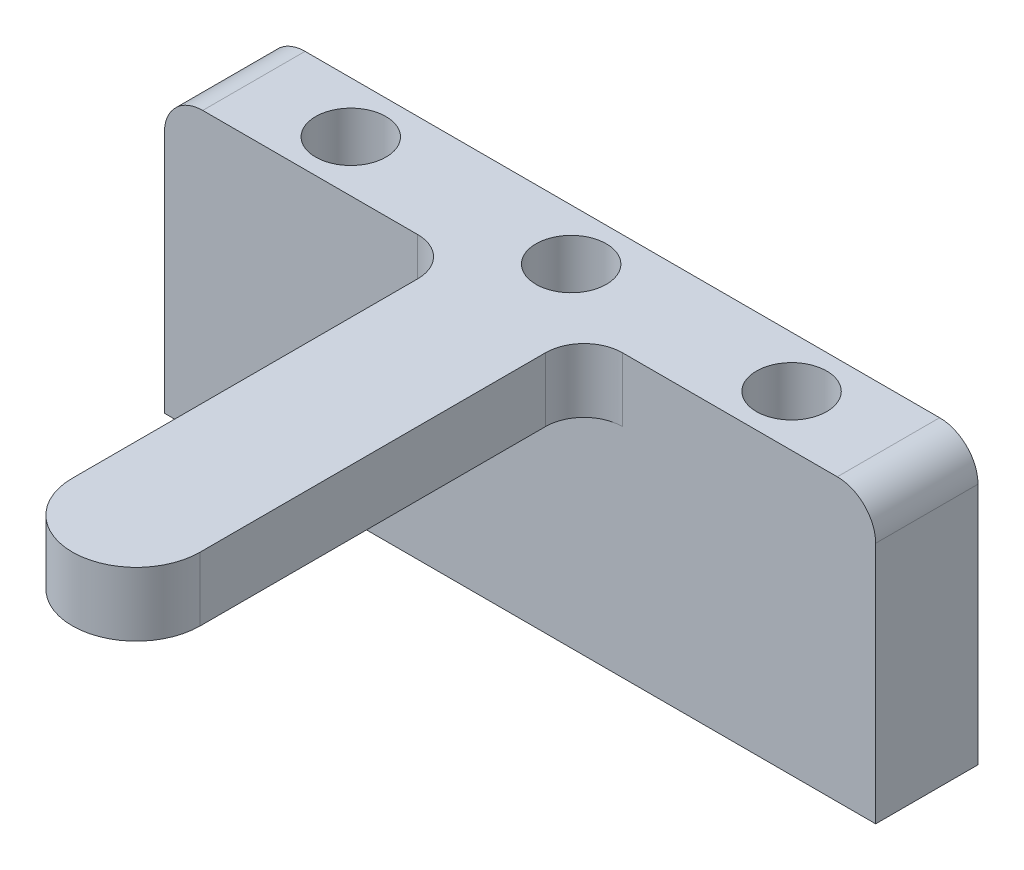
ISO-10303-21;
HEADER;
FILE_DESCRIPTION(('STEP AP214'),'2;1');
FILE_NAME('part.step','',(''),(''),'','','');
FILE_SCHEMA(('AUTOMOTIVE_DESIGN { 1 0 10303 214 1 1 1 1 }'));
ENDSEC;
DATA;
#1=APPLICATION_CONTEXT('core data for automotive mechanical design processes');
#2=APPLICATION_PROTOCOL_DEFINITION('international standard','automotive_design',2000,#1);
#3=PRODUCT_CONTEXT('',#1,'mechanical');
#4=PRODUCT('Part','Part','',(#3));
#5=PRODUCT_RELATED_PRODUCT_CATEGORY('part','',(#4));
#6=PRODUCT_DEFINITION_FORMATION('','',#4);
#7=PRODUCT_DEFINITION_CONTEXT('part definition',#1,'design');
#8=PRODUCT_DEFINITION('design','',#6,#7);
#9=PRODUCT_DEFINITION_SHAPE('','',#8);
#10=(LENGTH_UNIT() NAMED_UNIT(*) SI_UNIT(.MILLI.,.METRE.));
#11=(NAMED_UNIT(*) PLANE_ANGLE_UNIT() SI_UNIT($,.RADIAN.));
#12=(NAMED_UNIT(*) SI_UNIT($,.STERADIAN.) SOLID_ANGLE_UNIT());
#13=UNCERTAINTY_MEASURE_WITH_UNIT(LENGTH_MEASURE(1.E-05),#10,'distance_accuracy_value','');
#14=(GEOMETRIC_REPRESENTATION_CONTEXT(3) GLOBAL_UNCERTAINTY_ASSIGNED_CONTEXT((#13)) GLOBAL_UNIT_ASSIGNED_CONTEXT((#10,
#11,#12)) REPRESENTATION_CONTEXT('',''));
#15=CARTESIAN_POINT('',(0.,0.,0.));
#16=DIRECTION('',(0.,0.,1.));
#17=DIRECTION('',(1.,0.,0.));
#18=AXIS2_PLACEMENT_3D('',#15,#16,#17);
#19=CARTESIAN_POINT('',(0.,22.,0.));
#20=DIRECTION('',(0.,-1.,0.));
#21=DIRECTION('',(0.,0.,-1.));
#22=AXIS2_PLACEMENT_3D('',#19,#20,#21);
#23=PLANE('',#22);
#24=DIRECTION('',(1.,0.,0.));
#25=VECTOR('',#24,1.);
#26=CARTESIAN_POINT('',(0.,22.,0.));
#27=LINE('',#26,#25);
#28=CARTESIAN_POINT('',(35.805,22.,0.));
#29=VERTEX_POINT('',#28);
#30=CARTESIAN_POINT('',(52.61,22.,0.));
#31=VERTEX_POINT('',#30);
#32=EDGE_CURVE('E214',#29,#31,#27,.T.);
#33=ORIENTED_EDGE('',*,*,#32,.T.);
#34=DIRECTION('',(0.,0.,-1.));
#35=VECTOR('',#34,1.);
#36=CARTESIAN_POINT('',(52.61,22.,0.));
#37=LINE('',#36,#35);
#38=CARTESIAN_POINT('',(52.61,22.,-8.));
#39=VERTEX_POINT('',#38);
#40=EDGE_CURVE('E268',#31,#39,#37,.T.);
#41=ORIENTED_EDGE('',*,*,#40,.T.);
#42=DIRECTION('',(-1.,0.,0.));
#43=VECTOR('',#42,1.);
#44=CARTESIAN_POINT('',(0.,22.,-8.));
#45=LINE('',#44,#43);
#46=CARTESIAN_POINT('',(3.,22.,-8.));
#47=VERTEX_POINT('',#46);
#48=EDGE_CURVE('E213',#39,#47,#45,.T.);
#49=ORIENTED_EDGE('',*,*,#48,.T.);
#50=DIRECTION('',(0.,0.,1.));
#51=VECTOR('',#50,1.);
#52=CARTESIAN_POINT('',(3.,22.,0.));
#53=LINE('',#52,#51);
#54=CARTESIAN_POINT('',(3.,22.,0.));
#55=VERTEX_POINT('',#54);
#56=EDGE_CURVE('E264',#47,#55,#53,.T.);
#57=ORIENTED_EDGE('',*,*,#56,.T.);
#58=CARTESIAN_POINT('',(19.805,22.,0.));
#59=VERTEX_POINT('',#58);
#60=EDGE_CURVE('E210',#55,#59,#27,.T.);
#61=ORIENTED_EDGE('',*,*,#60,.T.);
#62=CARTESIAN_POINT('',(19.805,22.,3.));
#63=DIRECTION('',(0.,-1.,0.));
#64=DIRECTION('',(0.,0.,-1.));
#65=AXIS2_PLACEMENT_3D('',#62,#63,#64);
#66=CIRCLE('',#65,3.);
#67=CARTESIAN_POINT('',(22.805,22.,3.));
#68=VERTEX_POINT('',#67);
#69=EDGE_CURVE('E11',#59,#68,#66,.T.);
#70=ORIENTED_EDGE('',*,*,#69,.T.);
#71=DIRECTION('',(0.,0.,-1.));
#72=VECTOR('',#71,1.);
#73=CARTESIAN_POINT('',(22.805,22.,30.));
#74=LINE('',#73,#72);
#75=CARTESIAN_POINT('',(22.805,22.,30.));
#76=VERTEX_POINT('',#75);
#77=EDGE_CURVE('E137',#76,#68,#74,.T.);
#78=ORIENTED_EDGE('',*,*,#77,.F.);
#79=CARTESIAN_POINT('',(27.805,22.,30.));
#80=DIRECTION('',(0.,1.,0.));
#81=DIRECTION('',(0.,0.,-1.));
#82=AXIS2_PLACEMENT_3D('',#79,#80,#81);
#83=CIRCLE('',#82,5.);
#84=CARTESIAN_POINT('',(32.805,22.,30.));
#85=VERTEX_POINT('',#84);
#86=EDGE_CURVE('E143',#76,#85,#83,.T.);
#87=ORIENTED_EDGE('',*,*,#86,.T.);
#88=DIRECTION('',(0.,0.,-1.));
#89=VECTOR('',#88,1.);
#90=CARTESIAN_POINT('',(32.805,22.,30.));
#91=LINE('',#90,#89);
#92=CARTESIAN_POINT('',(32.805,22.,3.));
#93=VERTEX_POINT('',#92);
#94=EDGE_CURVE('E175',#85,#93,#91,.T.);
#95=ORIENTED_EDGE('',*,*,#94,.T.);
#96=CARTESIAN_POINT('',(35.805,22.,3.));
#97=DIRECTION('',(0.,-1.,0.));
#98=DIRECTION('',(0.,0.,-1.));
#99=AXIS2_PLACEMENT_3D('',#96,#97,#98);
#100=CIRCLE('',#99,3.);
#101=EDGE_CURVE('E285',#93,#29,#100,.T.);
#102=ORIENTED_EDGE('',*,*,#101,.T.);
#103=EDGE_LOOP('',(#33,#41,#49,#57,#61,#70,#78,#87,#95,#102));
#104=FACE_BOUND('',#103,.T.);
#105=CARTESIAN_POINT('',(27.805,22.,-4.));
#106=DIRECTION('',(0.,1.,0.));
#107=DIRECTION('',(0.,0.,1.));
#108=AXIS2_PLACEMENT_3D('',#105,#106,#107);
#109=CIRCLE('',#108,2.75);
#110=CARTESIAN_POINT('',(27.805,22.,-1.25));
#111=VERTEX_POINT('',#110);
#112=EDGE_CURVE('E202',#111,#111,#109,.T.);
#113=ORIENTED_EDGE('',*,*,#112,.F.);
#114=EDGE_LOOP('',(#113));
#115=FACE_BOUND('',#114,.T.);
#116=CARTESIAN_POINT('',(10.575,22.,-4.));
#117=DIRECTION('',(0.,1.,0.));
#118=DIRECTION('',(0.,0.,1.));
#119=AXIS2_PLACEMENT_3D('',#116,#117,#118);
#120=CIRCLE('',#119,2.75);
#121=CARTESIAN_POINT('',(10.575,22.,-1.25));
#122=VERTEX_POINT('',#121);
#123=EDGE_CURVE('E194',#122,#122,#120,.T.);
#124=ORIENTED_EDGE('',*,*,#123,.F.);
#125=EDGE_LOOP('',(#124));
#126=FACE_BOUND('',#125,.T.);
#127=CARTESIAN_POINT('',(45.035,22.,-4.));
#128=DIRECTION('',(0.,1.,0.));
#129=DIRECTION('',(0.,0.,1.));
#130=AXIS2_PLACEMENT_3D('',#127,#128,#129);
#131=CIRCLE('',#130,2.75);
#132=CARTESIAN_POINT('',(45.035,22.,-1.25));
#133=VERTEX_POINT('',#132);
#134=EDGE_CURVE('E186',#133,#133,#131,.T.);
#135=ORIENTED_EDGE('',*,*,#134,.F.);
#136=EDGE_LOOP('',(#135));
#137=FACE_BOUND('',#136,.T.);
#138=ADVANCED_FACE('F47',(#104,#115,#126,#137),#23,.F.);
#139=CARTESIAN_POINT('',(0.,0.,0.));
#140=DIRECTION('',(0.,-1.,0.));
#141=DIRECTION('',(0.,0.,-1.));
#142=AXIS2_PLACEMENT_3D('',#139,#140,#141);
#143=PLANE('',#142);
#144=CARTESIAN_POINT('',(10.575,0.,-4.));
#145=DIRECTION('',(0.,1.,0.));
#146=DIRECTION('',(0.,0.,1.));
#147=AXIS2_PLACEMENT_3D('',#144,#145,#146);
#148=CIRCLE('',#147,2.75);
#149=CARTESIAN_POINT('',(10.575,0.,-1.25));
#150=VERTEX_POINT('',#149);
#151=EDGE_CURVE('E190',#150,#150,#148,.T.);
#152=ORIENTED_EDGE('',*,*,#151,.T.);
#153=EDGE_LOOP('',(#152));
#154=FACE_BOUND('',#153,.T.);
#155=DIRECTION('',(0.,0.,1.));
#156=VECTOR('',#155,1.);
#157=CARTESIAN_POINT('',(0.,0.,0.));
#158=LINE('',#157,#156);
#159=CARTESIAN_POINT('',(0.,0.,-8.));
#160=VERTEX_POINT('',#159);
#161=CARTESIAN_POINT('',(0.,0.,0.));
#162=VERTEX_POINT('',#161);
#163=EDGE_CURVE('E206',#160,#162,#158,.T.);
#164=ORIENTED_EDGE('',*,*,#163,.F.);
#165=DIRECTION('',(-1.,0.,0.));
#166=VECTOR('',#165,1.);
#167=CARTESIAN_POINT('',(0.,0.,-8.));
#168=LINE('',#167,#166);
#169=CARTESIAN_POINT('',(55.61,0.,-8.));
#170=VERTEX_POINT('',#169);
#171=EDGE_CURVE('E230',#170,#160,#168,.T.);
#172=ORIENTED_EDGE('',*,*,#171,.F.);
#173=DIRECTION('',(0.,0.,-1.));
#174=VECTOR('',#173,1.);
#175=CARTESIAN_POINT('',(55.61,0.,0.));
#176=LINE('',#175,#174);
#177=CARTESIAN_POINT('',(55.61,0.,0.));
#178=VERTEX_POINT('',#177);
#179=EDGE_CURVE('E226',#178,#170,#176,.T.);
#180=ORIENTED_EDGE('',*,*,#179,.F.);
#181=DIRECTION('',(1.,0.,0.));
#182=VECTOR('',#181,1.);
#183=CARTESIAN_POINT('',(0.,0.,0.));
#184=LINE('',#183,#182);
#185=EDGE_CURVE('E222',#162,#178,#184,.T.);
#186=ORIENTED_EDGE('',*,*,#185,.F.);
#187=EDGE_LOOP('',(#164,#172,#180,#186));
#188=FACE_BOUND('',#187,.T.);
#189=CARTESIAN_POINT('',(27.805,0.,-4.));
#190=DIRECTION('',(0.,1.,0.));
#191=DIRECTION('',(0.,0.,1.));
#192=AXIS2_PLACEMENT_3D('',#189,#190,#191);
#193=CIRCLE('',#192,2.75);
#194=CARTESIAN_POINT('',(27.805,0.,-1.25));
#195=VERTEX_POINT('',#194);
#196=EDGE_CURVE('E198',#195,#195,#193,.T.);
#197=ORIENTED_EDGE('',*,*,#196,.T.);
#198=EDGE_LOOP('',(#197));
#199=FACE_BOUND('',#198,.T.);
#200=CARTESIAN_POINT('',(45.035,0.,-4.));
#201=DIRECTION('',(0.,1.,0.));
#202=DIRECTION('',(0.,0.,1.));
#203=AXIS2_PLACEMENT_3D('',#200,#201,#202);
#204=CIRCLE('',#203,2.75);
#205=CARTESIAN_POINT('',(45.035,0.,-1.25));
#206=VERTEX_POINT('',#205);
#207=EDGE_CURVE('E150',#206,#206,#204,.T.);
#208=ORIENTED_EDGE('',*,*,#207,.T.);
#209=EDGE_LOOP('',(#208));
#210=FACE_BOUND('',#209,.T.);
#211=ADVANCED_FACE('F307',(#154,#188,#199,#210),#143,.T.);
#212=CARTESIAN_POINT('',(0.,22.,0.));
#213=DIRECTION('',(1.,0.,0.));
#214=DIRECTION('',(0.,0.,-1.));
#215=AXIS2_PLACEMENT_3D('',#212,#213,#214);
#216=PLANE('',#215);
#217=DIRECTION('',(0.,-1.,0.));
#218=VECTOR('',#217,1.);
#219=CARTESIAN_POINT('',(0.,22.,0.));
#220=LINE('',#219,#218);
#221=CARTESIAN_POINT('',(0.,19.,0.));
#222=VERTEX_POINT('',#221);
#223=EDGE_CURVE('E242',#222,#162,#220,.T.);
#224=ORIENTED_EDGE('',*,*,#223,.F.);
#225=DIRECTION('',(0.,0.,1.));
#226=VECTOR('',#225,1.);
#227=CARTESIAN_POINT('',(0.,19.,0.));
#228=LINE('',#227,#226);
#229=CARTESIAN_POINT('',(0.,19.,-8.));
#230=VERTEX_POINT('',#229);
#231=EDGE_CURVE('E71',#222,#230,#228,.F.);
#232=ORIENTED_EDGE('',*,*,#231,.T.);
#233=DIRECTION('',(0.,-1.,0.));
#234=VECTOR('',#233,1.);
#235=CARTESIAN_POINT('',(0.,22.,-8.));
#236=LINE('',#235,#234);
#237=EDGE_CURVE('E218',#230,#160,#236,.T.);
#238=ORIENTED_EDGE('',*,*,#237,.T.);
#239=ORIENTED_EDGE('',*,*,#163,.T.);
#240=EDGE_LOOP('',(#224,#232,#238,#239));
#241=FACE_BOUND('',#240,.T.);
#242=ADVANCED_FACE('F303',(#241),#216,.F.);
#243=CARTESIAN_POINT('',(0.,22.,0.));
#244=DIRECTION('',(0.,0.,-1.));
#245=DIRECTION('',(-1.,0.,0.));
#246=AXIS2_PLACEMENT_3D('',#243,#244,#245);
#247=PLANE('',#246);
#248=ORIENTED_EDGE('',*,*,#32,.F.);
#249=DIRECTION('',(0.,-1.,0.));
#250=VECTOR('',#249,1.);
#251=CARTESIAN_POINT('',(35.805,22.,0.));
#252=LINE('',#251,#250);
#253=CARTESIAN_POINT('',(35.805,17.,0.));
#254=VERTEX_POINT('',#253);
#255=EDGE_CURVE('E254',#29,#254,#252,.T.);
#256=ORIENTED_EDGE('',*,*,#255,.T.);
#257=DIRECTION('',(-1.,0.,0.));
#258=VECTOR('',#257,1.);
#259=CARTESIAN_POINT('',(0.,17.,0.));
#260=LINE('',#259,#258);
#261=CARTESIAN_POINT('',(19.805,17.,0.));
#262=VERTEX_POINT('',#261);
#263=EDGE_CURVE('E162',#254,#262,#260,.T.);
#264=ORIENTED_EDGE('',*,*,#263,.T.);
#265=DIRECTION('',(0.,-1.,0.));
#266=VECTOR('',#265,1.);
#267=CARTESIAN_POINT('',(19.805,22.,0.));
#268=LINE('',#267,#266);
#269=EDGE_CURVE('E251',#262,#59,#268,.F.);
#270=ORIENTED_EDGE('',*,*,#269,.T.);
#271=ORIENTED_EDGE('',*,*,#60,.F.);
#272=CARTESIAN_POINT('',(3.,19.,0.));
#273=DIRECTION('',(0.,0.,-1.));
#274=DIRECTION('',(-1.,0.,0.));
#275=AXIS2_PLACEMENT_3D('',#272,#273,#274);
#276=CIRCLE('',#275,3.);
#277=EDGE_CURVE('E245',#55,#222,#276,.F.);
#278=ORIENTED_EDGE('',*,*,#277,.T.);
#279=ORIENTED_EDGE('',*,*,#223,.T.);
#280=ORIENTED_EDGE('',*,*,#185,.T.);
#281=DIRECTION('',(0.,-1.,0.));
#282=VECTOR('',#281,1.);
#283=CARTESIAN_POINT('',(55.61,22.,0.));
#284=LINE('',#283,#282);
#285=CARTESIAN_POINT('',(55.61,19.,0.));
#286=VERTEX_POINT('',#285);
#287=EDGE_CURVE('E239',#286,#178,#284,.T.);
#288=ORIENTED_EDGE('',*,*,#287,.F.);
#289=CARTESIAN_POINT('',(52.61,19.,0.));
#290=DIRECTION('',(0.,0.,-1.));
#291=DIRECTION('',(-1.,0.,0.));
#292=AXIS2_PLACEMENT_3D('',#289,#290,#291);
#293=CIRCLE('',#292,3.);
#294=EDGE_CURVE('E248',#286,#31,#293,.F.);
#295=ORIENTED_EDGE('',*,*,#294,.T.);
#296=EDGE_LOOP('',(#248,#256,#264,#270,#271,#278,#279,#280,#288,#295));
#297=FACE_BOUND('',#296,.T.);
#298=ADVANCED_FACE('F298',(#297),#247,.F.);
#299=CARTESIAN_POINT('',(55.61,22.,0.));
#300=DIRECTION('',(-1.,0.,0.));
#301=DIRECTION('',(0.,0.,1.));
#302=AXIS2_PLACEMENT_3D('',#299,#300,#301);
#303=PLANE('',#302);
#304=DIRECTION('',(0.,-1.,0.));
#305=VECTOR('',#304,1.);
#306=CARTESIAN_POINT('',(55.61,22.,-8.));
#307=LINE('',#306,#305);
#308=CARTESIAN_POINT('',(55.61,19.,-8.));
#309=VERTEX_POINT('',#308);
#310=EDGE_CURVE('E236',#309,#170,#307,.T.);
#311=ORIENTED_EDGE('',*,*,#310,.F.);
#312=DIRECTION('',(0.,0.,-1.));
#313=VECTOR('',#312,1.);
#314=CARTESIAN_POINT('',(55.61,19.,0.));
#315=LINE('',#314,#313);
#316=EDGE_CURVE('E277',#309,#286,#315,.F.);
#317=ORIENTED_EDGE('',*,*,#316,.T.);
#318=ORIENTED_EDGE('',*,*,#287,.T.);
#319=ORIENTED_EDGE('',*,*,#179,.T.);
#320=EDGE_LOOP('',(#311,#317,#318,#319));
#321=FACE_BOUND('',#320,.T.);
#322=ADVANCED_FACE('F318',(#321),#303,.F.);
#323=CARTESIAN_POINT('',(0.,22.,-8.));
#324=DIRECTION('',(0.,0.,1.));
#325=DIRECTION('',(1.,0.,0.));
#326=AXIS2_PLACEMENT_3D('',#323,#324,#325);
#327=PLANE('',#326);
#328=ORIENTED_EDGE('',*,*,#48,.F.);
#329=CARTESIAN_POINT('',(52.61,19.,-8.));
#330=DIRECTION('',(0.,0.,1.));
#331=DIRECTION('',(1.,0.,0.));
#332=AXIS2_PLACEMENT_3D('',#329,#330,#331);
#333=CIRCLE('',#332,3.);
#334=EDGE_CURVE('E63',#39,#309,#333,.F.);
#335=ORIENTED_EDGE('',*,*,#334,.T.);
#336=ORIENTED_EDGE('',*,*,#310,.T.);
#337=ORIENTED_EDGE('',*,*,#171,.T.);
#338=ORIENTED_EDGE('',*,*,#237,.F.);
#339=CARTESIAN_POINT('',(3.,19.,-8.));
#340=DIRECTION('',(0.,0.,1.));
#341=DIRECTION('',(1.,0.,0.));
#342=AXIS2_PLACEMENT_3D('',#339,#340,#341);
#343=CIRCLE('',#342,3.);
#344=EDGE_CURVE('E272',#230,#47,#343,.F.);
#345=ORIENTED_EDGE('',*,*,#344,.T.);
#346=EDGE_LOOP('',(#328,#335,#336,#337,#338,#345));
#347=FACE_BOUND('',#346,.T.);
#348=ADVANCED_FACE('F317',(#347),#327,.F.);
#349=CARTESIAN_POINT('',(27.805,22.,-4.));
#350=DIRECTION('',(0.,-1.,0.));
#351=DIRECTION('',(0.,0.,-1.));
#352=AXIS2_PLACEMENT_3D('',#349,#350,#351);
#353=CYLINDRICAL_SURFACE('',#352,2.75);
#354=ORIENTED_EDGE('',*,*,#112,.T.);
#355=EDGE_LOOP('',(#354));
#356=FACE_BOUND('',#355,.T.);
#357=ORIENTED_EDGE('',*,*,#196,.F.);
#358=EDGE_LOOP('',(#357));
#359=FACE_BOUND('',#358,.T.);
#360=ADVANCED_FACE('F325',(#356,#359),#353,.F.);
#361=CARTESIAN_POINT('',(10.575,22.,-4.));
#362=DIRECTION('',(0.,-1.,0.));
#363=DIRECTION('',(0.,0.,-1.));
#364=AXIS2_PLACEMENT_3D('',#361,#362,#363);
#365=CYLINDRICAL_SURFACE('',#364,2.75);
#366=ORIENTED_EDGE('',*,*,#123,.T.);
#367=EDGE_LOOP('',(#366));
#368=FACE_BOUND('',#367,.T.);
#369=ORIENTED_EDGE('',*,*,#151,.F.);
#370=EDGE_LOOP('',(#369));
#371=FACE_BOUND('',#370,.T.);
#372=ADVANCED_FACE('F340',(#368,#371),#365,.F.);
#373=CARTESIAN_POINT('',(45.035,22.,-4.));
#374=DIRECTION('',(0.,-1.,0.));
#375=DIRECTION('',(0.,0.,-1.));
#376=AXIS2_PLACEMENT_3D('',#373,#374,#375);
#377=CYLINDRICAL_SURFACE('',#376,2.75);
#378=ORIENTED_EDGE('',*,*,#134,.T.);
#379=EDGE_LOOP('',(#378));
#380=FACE_BOUND('',#379,.T.);
#381=ORIENTED_EDGE('',*,*,#207,.F.);
#382=EDGE_LOOP('',(#381));
#383=FACE_BOUND('',#382,.T.);
#384=ADVANCED_FACE('F344',(#380,#383),#377,.F.);
#385=CARTESIAN_POINT('',(22.805,0.,30.));
#386=DIRECTION('',(1.,0.,0.));
#387=DIRECTION('',(0.,0.,-1.));
#388=AXIS2_PLACEMENT_3D('',#385,#386,#387);
#389=PLANE('',#388);
#390=ORIENTED_EDGE('',*,*,#77,.T.);
#391=DIRECTION('',(0.,-1.,0.));
#392=VECTOR('',#391,1.);
#393=CARTESIAN_POINT('',(22.805,17.,3.));
#394=LINE('',#393,#392);
#395=CARTESIAN_POINT('',(22.805,17.,3.));
#396=VERTEX_POINT('',#395);
#397=EDGE_CURVE('E261',#68,#396,#394,.T.);
#398=ORIENTED_EDGE('',*,*,#397,.T.);
#399=DIRECTION('',(0.,0.,-1.));
#400=VECTOR('',#399,1.);
#401=CARTESIAN_POINT('',(22.805,17.,30.));
#402=LINE('',#401,#400);
#403=CARTESIAN_POINT('',(22.805,17.,30.));
#404=VERTEX_POINT('',#403);
#405=EDGE_CURVE('E151',#404,#396,#402,.T.);
#406=ORIENTED_EDGE('',*,*,#405,.F.);
#407=DIRECTION('',(0.,-1.,0.));
#408=VECTOR('',#407,1.);
#409=CARTESIAN_POINT('',(22.805,0.,30.));
#410=LINE('',#409,#408);
#411=EDGE_CURVE('E154',#76,#404,#410,.T.);
#412=ORIENTED_EDGE('',*,*,#411,.F.);
#413=EDGE_LOOP('',(#390,#398,#406,#412));
#414=FACE_BOUND('',#413,.T.);
#415=ADVANCED_FACE('F155',(#414),#389,.F.);
#416=CARTESIAN_POINT('',(0.,17.,30.));
#417=DIRECTION('',(0.,-1.,0.));
#418=DIRECTION('',(0.,0.,-1.));
#419=AXIS2_PLACEMENT_3D('',#416,#417,#418);
#420=PLANE('',#419);
#421=ORIENTED_EDGE('',*,*,#263,.F.);
#422=CARTESIAN_POINT('',(35.805,17.,3.));
#423=DIRECTION('',(0.,-1.,0.));
#424=DIRECTION('',(0.,0.,-1.));
#425=AXIS2_PLACEMENT_3D('',#422,#423,#424);
#426=CIRCLE('',#425,3.);
#427=CARTESIAN_POINT('',(32.805,17.,3.));
#428=VERTEX_POINT('',#427);
#429=EDGE_CURVE('E282',#254,#428,#426,.F.);
#430=ORIENTED_EDGE('',*,*,#429,.T.);
#431=DIRECTION('',(0.,0.,-1.));
#432=VECTOR('',#431,1.);
#433=CARTESIAN_POINT('',(32.805,17.,30.));
#434=LINE('',#433,#432);
#435=CARTESIAN_POINT('',(32.805,17.,30.));
#436=VERTEX_POINT('',#435);
#437=EDGE_CURVE('E180',#436,#428,#434,.T.);
#438=ORIENTED_EDGE('',*,*,#437,.F.);
#439=CARTESIAN_POINT('',(27.805,17.,30.));
#440=DIRECTION('',(0.,1.,0.));
#441=DIRECTION('',(0.,0.,-1.));
#442=AXIS2_PLACEMENT_3D('',#439,#440,#441);
#443=CIRCLE('',#442,5.);
#444=EDGE_CURVE('E168',#404,#436,#443,.T.);
#445=ORIENTED_EDGE('',*,*,#444,.F.);
#446=ORIENTED_EDGE('',*,*,#405,.T.);
#447=CARTESIAN_POINT('',(19.805,17.,3.));
#448=DIRECTION('',(0.,-1.,0.));
#449=DIRECTION('',(0.,0.,-1.));
#450=AXIS2_PLACEMENT_3D('',#447,#448,#449);
#451=CIRCLE('',#450,3.);
#452=EDGE_CURVE('E56',#396,#262,#451,.F.);
#453=ORIENTED_EDGE('',*,*,#452,.T.);
#454=EDGE_LOOP('',(#421,#430,#438,#445,#446,#453));
#455=FACE_BOUND('',#454,.T.);
#456=ADVANCED_FACE('F291',(#455),#420,.T.);
#457=CARTESIAN_POINT('',(32.805,0.,30.));
#458=DIRECTION('',(1.,0.,0.));
#459=DIRECTION('',(0.,0.,-1.));
#460=AXIS2_PLACEMENT_3D('',#457,#458,#459);
#461=PLANE('',#460);
#462=ORIENTED_EDGE('',*,*,#437,.T.);
#463=DIRECTION('',(0.,-1.,0.));
#464=VECTOR('',#463,1.);
#465=CARTESIAN_POINT('',(32.805,0.,3.));
#466=LINE('',#465,#464);
#467=EDGE_CURVE('E258',#428,#93,#466,.F.);
#468=ORIENTED_EDGE('',*,*,#467,.T.);
#469=ORIENTED_EDGE('',*,*,#94,.F.);
#470=DIRECTION('',(0.,-1.,0.));
#471=VECTOR('',#470,1.);
#472=CARTESIAN_POINT('',(32.805,0.,30.));
#473=LINE('',#472,#471);
#474=EDGE_CURVE('E161',#85,#436,#473,.T.);
#475=ORIENTED_EDGE('',*,*,#474,.T.);
#476=EDGE_LOOP('',(#462,#468,#469,#475));
#477=FACE_BOUND('',#476,.T.);
#478=ADVANCED_FACE('F353',(#477),#461,.T.);
#479=CARTESIAN_POINT('',(27.805,17.,30.));
#480=DIRECTION('',(0.,1.,0.));
#481=DIRECTION('',(0.,0.,1.));
#482=AXIS2_PLACEMENT_3D('',#479,#480,#481);
#483=CYLINDRICAL_SURFACE('',#482,5.);
#484=ORIENTED_EDGE('',*,*,#86,.F.);
#485=ORIENTED_EDGE('',*,*,#411,.T.);
#486=ORIENTED_EDGE('',*,*,#444,.T.);
#487=ORIENTED_EDGE('',*,*,#474,.F.);
#488=EDGE_LOOP('',(#484,#485,#486,#487));
#489=FACE_BOUND('',#488,.T.);
#490=ADVANCED_FACE('F165',(#489),#483,.T.);
#491=CARTESIAN_POINT('',(35.805,22.,3.));
#492=DIRECTION('',(0.,-1.,0.));
#493=DIRECTION('',(0.,0.,-1.));
#494=AXIS2_PLACEMENT_3D('',#491,#492,#493);
#495=CYLINDRICAL_SURFACE('',#494,3.);
#496=ORIENTED_EDGE('',*,*,#101,.F.);
#497=ORIENTED_EDGE('',*,*,#467,.F.);
#498=ORIENTED_EDGE('',*,*,#429,.F.);
#499=ORIENTED_EDGE('',*,*,#255,.F.);
#500=EDGE_LOOP('',(#496,#497,#498,#499));
#501=FACE_BOUND('',#500,.T.);
#502=ADVANCED_FACE('F357',(#501),#495,.F.);
#503=CARTESIAN_POINT('',(19.805,0.,3.));
#504=DIRECTION('',(0.,1.,0.));
#505=DIRECTION('',(0.,0.,1.));
#506=AXIS2_PLACEMENT_3D('',#503,#504,#505);
#507=CYLINDRICAL_SURFACE('',#506,3.);
#508=ORIENTED_EDGE('',*,*,#69,.F.);
#509=ORIENTED_EDGE('',*,*,#269,.F.);
#510=ORIENTED_EDGE('',*,*,#452,.F.);
#511=ORIENTED_EDGE('',*,*,#397,.F.);
#512=EDGE_LOOP('',(#508,#509,#510,#511));
#513=FACE_BOUND('',#512,.T.);
#514=ADVANCED_FACE('F294',(#513),#507,.F.);
#515=CARTESIAN_POINT('',(52.61,19.,0.));
#516=DIRECTION('',(0.,0.,-1.));
#517=DIRECTION('',(-1.,0.,0.));
#518=AXIS2_PLACEMENT_3D('',#515,#516,#517);
#519=CYLINDRICAL_SURFACE('',#518,3.);
#520=ORIENTED_EDGE('',*,*,#294,.F.);
#521=ORIENTED_EDGE('',*,*,#316,.F.);
#522=ORIENTED_EDGE('',*,*,#334,.F.);
#523=ORIENTED_EDGE('',*,*,#40,.F.);
#524=EDGE_LOOP('',(#520,#521,#522,#523));
#525=FACE_BOUND('',#524,.T.);
#526=ADVANCED_FACE('F316',(#525),#519,.T.);
#527=CARTESIAN_POINT('',(3.,19.,0.));
#528=DIRECTION('',(0.,0.,1.));
#529=DIRECTION('',(1.,0.,0.));
#530=AXIS2_PLACEMENT_3D('',#527,#528,#529);
#531=CYLINDRICAL_SURFACE('',#530,3.);
#532=ORIENTED_EDGE('',*,*,#344,.F.);
#533=ORIENTED_EDGE('',*,*,#231,.F.);
#534=ORIENTED_EDGE('',*,*,#277,.F.);
#535=ORIENTED_EDGE('',*,*,#56,.F.);
#536=EDGE_LOOP('',(#532,#533,#534,#535));
#537=FACE_BOUND('',#536,.T.);
#538=ADVANCED_FACE('F49',(#537),#531,.T.);
#539=CLOSED_SHELL('',(#138,#211,#242,#298,#322,#348,#360,#372,#384,#415,#456,#478,#490,#502,
#514,#526,#538));
#540=MANIFOLD_SOLID_BREP('B2',#539);
#541=ADVANCED_BREP_SHAPE_REPRESENTATION('',(#18,#540),#14);
#542=SHAPE_DEFINITION_REPRESENTATION(#9,#541);
ENDSEC;
END-ISO-10303-21;
